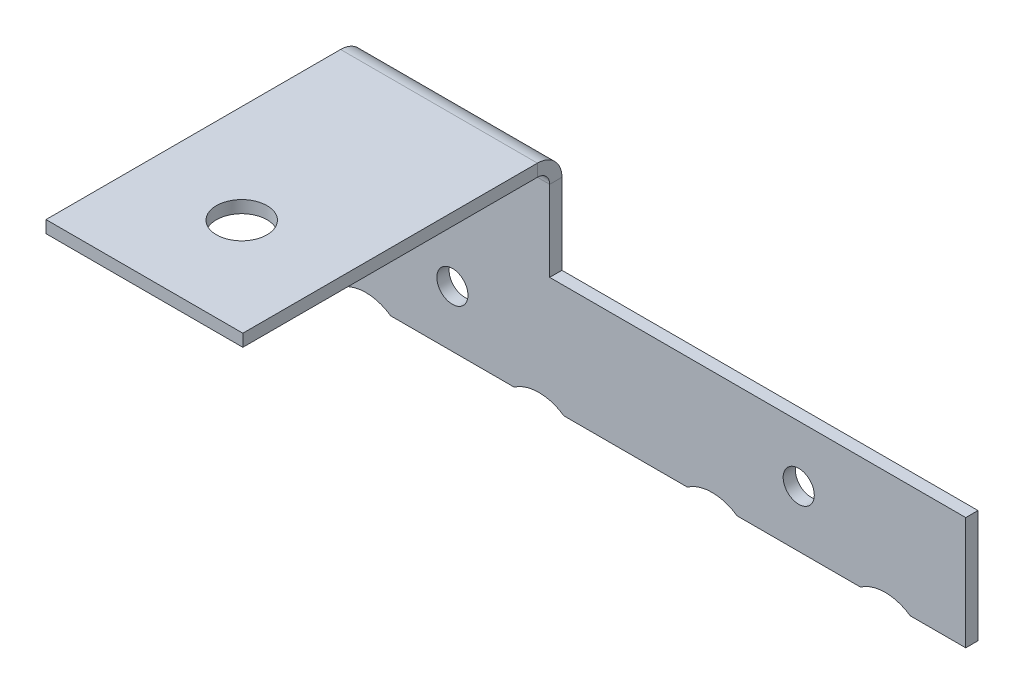
ISO-10303-21;
HEADER;
FILE_DESCRIPTION(('STEP AP214'),'2;1');
FILE_NAME('part.step','',(''),(''),'','','');
FILE_SCHEMA(('AUTOMOTIVE_DESIGN { 1 0 10303 214 1 1 1 1 }'));
ENDSEC;
DATA;
#1=APPLICATION_CONTEXT('core data for automotive mechanical design processes');
#2=APPLICATION_PROTOCOL_DEFINITION('international standard','automotive_design',2000,#1);
#3=PRODUCT_CONTEXT('',#1,'mechanical');
#4=PRODUCT('Part','Part','',(#3));
#5=PRODUCT_RELATED_PRODUCT_CATEGORY('part','',(#4));
#6=PRODUCT_DEFINITION_FORMATION('','',#4);
#7=PRODUCT_DEFINITION_CONTEXT('part definition',#1,'design');
#8=PRODUCT_DEFINITION('design','',#6,#7);
#9=PRODUCT_DEFINITION_SHAPE('','',#8);
#10=(LENGTH_UNIT() NAMED_UNIT(*) SI_UNIT(.MILLI.,.METRE.));
#11=(NAMED_UNIT(*) PLANE_ANGLE_UNIT() SI_UNIT($,.RADIAN.));
#12=(NAMED_UNIT(*) SI_UNIT($,.STERADIAN.) SOLID_ANGLE_UNIT());
#13=UNCERTAINTY_MEASURE_WITH_UNIT(LENGTH_MEASURE(1.E-05),#10,'distance_accuracy_value','');
#14=(GEOMETRIC_REPRESENTATION_CONTEXT(3) GLOBAL_UNCERTAINTY_ASSIGNED_CONTEXT((#13)) GLOBAL_UNIT_ASSIGNED_CONTEXT((#10,
#11,#12)) REPRESENTATION_CONTEXT('',''));
#15=CARTESIAN_POINT('',(0.,0.,0.));
#16=DIRECTION('',(0.,0.,1.));
#17=DIRECTION('',(1.,0.,0.));
#18=AXIS2_PLACEMENT_3D('',#15,#16,#17);
#19=CARTESIAN_POINT('',(-1.69445308686878,31.545800002,1.6));
#20=DIRECTION('',(-1.,0.,0.));
#21=DIRECTION('',(0.,-1.,0.));
#22=AXIS2_PLACEMENT_3D('',#19,#20,#21);
#23=PLANE('',#22);
#24=DIRECTION('',(0.,-1.,0.));
#25=VECTOR('',#24,1.);
#26=CARTESIAN_POINT('',(-1.69445308686878,31.545800002,1.6));
#27=LINE('',#26,#25);
#28=CARTESIAN_POINT('',(-1.69445308686878,29.9457999,1.6));
#29=VERTEX_POINT('',#28);
#30=CARTESIAN_POINT('',(-1.69445308686877,19.430000002,1.6));
#31=VERTEX_POINT('',#30);
#32=EDGE_CURVE('E243',#29,#31,#27,.T.);
#33=ORIENTED_EDGE('',*,*,#32,.F.);
#34=DIRECTION('',(0.,0.,-1.));
#35=VECTOR('',#34,1.);
#36=CARTESIAN_POINT('',(-1.69445308686877,29.9457999,1.6));
#37=LINE('',#36,#35);
#38=CARTESIAN_POINT('',(-1.69445308686877,29.9457999,-1.0200000045979E-07));
#39=VERTEX_POINT('',#38);
#40=EDGE_CURVE('E231',#29,#39,#37,.T.);
#41=ORIENTED_EDGE('',*,*,#40,.T.);
#42=DIRECTION('',(0.,1.,0.));
#43=VECTOR('',#42,1.);
#44=CARTESIAN_POINT('',(-1.69445308686877,0.,-1.01999999809269E-07));
#45=LINE('',#44,#43);
#46=CARTESIAN_POINT('',(-1.69445308686877,19.430000002,-1.01999999809269E-07));
#47=VERTEX_POINT('',#46);
#48=EDGE_CURVE('E293',#39,#47,#45,.F.);
#49=ORIENTED_EDGE('',*,*,#48,.T.);
#50=DIRECTION('',(0.,0.,1.));
#51=VECTOR('',#50,1.);
#52=CARTESIAN_POINT('',(-1.69445308686877,19.430000002,1.6));
#53=LINE('',#52,#51);
#54=EDGE_CURVE('E11',#47,#31,#53,.T.);
#55=ORIENTED_EDGE('',*,*,#54,.T.);
#56=EDGE_LOOP('',(#33,#41,#49,#55));
#57=FACE_BOUND('',#56,.T.);
#58=ADVANCED_FACE('F38',(#57),#23,.T.);
#59=CARTESIAN_POINT('',(67.818,0.,1.6));
#60=DIRECTION('',(0.,0.,1.));
#61=DIRECTION('',(1.,0.,0.));
#62=AXIS2_PLACEMENT_3D('',#59,#60,#61);
#63=PLANE('',#62);
#64=CARTESIAN_POINT('',(11.3029999999999,12.065,1.6));
#65=DIRECTION('',(0.,0.,1.));
#66=DIRECTION('',(1.,0.,0.));
#67=AXIS2_PLACEMENT_3D('',#64,#65,#66);
#68=CIRCLE('',#67,2.032);
#69=CARTESIAN_POINT('',(13.3349999999999,12.065,1.6));
#70=VERTEX_POINT('',#69);
#71=EDGE_CURVE('E240',#70,#70,#68,.T.);
#72=ORIENTED_EDGE('',*,*,#71,.F.);
#73=EDGE_LOOP('',(#72));
#74=FACE_BOUND('',#73,.T.);
#75=CARTESIAN_POINT('',(56.5149999999999,12.065,1.6));
#76=DIRECTION('',(0.,0.,1.));
#77=DIRECTION('',(1.,0.,0.));
#78=AXIS2_PLACEMENT_3D('',#75,#76,#77);
#79=CIRCLE('',#78,2.032);
#80=CARTESIAN_POINT('',(58.5469999999999,12.065,1.6));
#81=VERTEX_POINT('',#80);
#82=EDGE_CURVE('E287',#81,#81,#79,.T.);
#83=ORIENTED_EDGE('',*,*,#82,.F.);
#84=EDGE_LOOP('',(#83));
#85=FACE_BOUND('',#84,.T.);
#86=DIRECTION('',(0.,1.,0.));
#87=VECTOR('',#86,1.);
#88=CARTESIAN_POINT('',(24.0029999999999,31.545800002,1.6));
#89=LINE('',#88,#87);
#90=CARTESIAN_POINT('',(24.0029999999999,19.430000002,1.6));
#91=VERTEX_POINT('',#90);
#92=CARTESIAN_POINT('',(24.0029999999999,29.9457999,1.6));
#93=VERTEX_POINT('',#92);
#94=EDGE_CURVE('E285',#91,#93,#89,.T.);
#95=ORIENTED_EDGE('',*,*,#94,.T.);
#96=DIRECTION('',(-1.,0.,0.));
#97=VECTOR('',#96,1.);
#98=CARTESIAN_POINT('',(-1.69445308686877,29.9457999,1.6));
#99=LINE('',#98,#97);
#100=EDGE_CURVE('E61',#29,#93,#99,.F.);
#101=ORIENTED_EDGE('',*,*,#100,.F.);
#102=ORIENTED_EDGE('',*,*,#32,.T.);
#103=DIRECTION('',(-1.,0.,0.));
#104=VECTOR('',#103,1.);
#105=CARTESIAN_POINT('',(-1.69445308686877,19.430000002,1.6));
#106=LINE('',#105,#104);
#107=CARTESIAN_POINT('',(-10.5,19.430000002,1.6));
#108=VERTEX_POINT('',#107);
#109=EDGE_CURVE('E246',#31,#108,#106,.T.);
#110=ORIENTED_EDGE('',*,*,#109,.T.);
#111=DIRECTION('',(0.,-1.,0.));
#112=VECTOR('',#111,1.);
#113=CARTESIAN_POINT('',(-10.5,4.699999998,1.6));
#114=LINE('',#113,#112);
#115=CARTESIAN_POINT('',(-10.5,4.699999998,1.6));
#116=VERTEX_POINT('',#115);
#117=EDGE_CURVE('E249',#108,#116,#114,.T.);
#118=ORIENTED_EDGE('',*,*,#117,.T.);
#119=DIRECTION('',(1.,0.,0.));
#120=VECTOR('',#119,1.);
#121=CARTESIAN_POINT('',(-10.5,4.699999998,1.6));
#122=LINE('',#121,#120);
#123=CARTESIAN_POINT('',(-3.25309944451995,4.699999998,1.6));
#124=VERTEX_POINT('',#123);
#125=EDGE_CURVE('E252',#116,#124,#122,.T.);
#126=ORIENTED_EDGE('',*,*,#125,.T.);
#127=CARTESIAN_POINT('',(0.,0.,1.6));
#128=DIRECTION('',(0.,0.,-1.));
#129=DIRECTION('',(1.,0.,0.));
#130=AXIS2_PLACEMENT_3D('',#127,#128,#129);
#131=CIRCLE('',#130,5.715999998);
#132=CARTESIAN_POINT('',(3.25309944451995,4.699999998,1.6));
#133=VERTEX_POINT('',#132);
#134=EDGE_CURVE('E255',#124,#133,#131,.T.);
#135=ORIENTED_EDGE('',*,*,#134,.T.);
#136=DIRECTION('',(1.,0.,0.));
#137=VECTOR('',#136,1.);
#138=CARTESIAN_POINT('',(3.25309944451995,4.699999998,1.6));
#139=LINE('',#138,#137);
#140=CARTESIAN_POINT('',(19.3529005554801,4.699999998,1.6));
#141=VERTEX_POINT('',#140);
#142=EDGE_CURVE('E258',#133,#141,#139,.T.);
#143=ORIENTED_EDGE('',*,*,#142,.T.);
#144=CARTESIAN_POINT('',(22.606,0.,1.6));
#145=DIRECTION('',(0.,0.,-1.));
#146=DIRECTION('',(1.,0.,0.));
#147=AXIS2_PLACEMENT_3D('',#144,#145,#146);
#148=CIRCLE('',#147,5.715999998);
#149=CARTESIAN_POINT('',(25.85909944452,4.699999998,1.6));
#150=VERTEX_POINT('',#149);
#151=EDGE_CURVE('E261',#141,#150,#148,.T.);
#152=ORIENTED_EDGE('',*,*,#151,.T.);
#153=DIRECTION('',(1.,0.,0.));
#154=VECTOR('',#153,1.);
#155=CARTESIAN_POINT('',(25.85909944452,4.699999998,1.6));
#156=LINE('',#155,#154);
#157=CARTESIAN_POINT('',(41.95890055548,4.699999998,1.6));
#158=VERTEX_POINT('',#157);
#159=EDGE_CURVE('E264',#150,#158,#156,.T.);
#160=ORIENTED_EDGE('',*,*,#159,.T.);
#161=CARTESIAN_POINT('',(45.212,0.,1.6));
#162=DIRECTION('',(0.,0.,-1.));
#163=DIRECTION('',(1.,0.,0.));
#164=AXIS2_PLACEMENT_3D('',#161,#162,#163);
#165=CIRCLE('',#164,5.715999998);
#166=CARTESIAN_POINT('',(48.46509944452,4.699999998,1.6));
#167=VERTEX_POINT('',#166);
#168=EDGE_CURVE('E267',#158,#167,#165,.T.);
#169=ORIENTED_EDGE('',*,*,#168,.T.);
#170=DIRECTION('',(1.,0.,0.));
#171=VECTOR('',#170,1.);
#172=CARTESIAN_POINT('',(48.46509944452,4.699999998,1.6));
#173=LINE('',#172,#171);
#174=CARTESIAN_POINT('',(64.5649005554801,4.699999998,1.6));
#175=VERTEX_POINT('',#174);
#176=EDGE_CURVE('E270',#167,#175,#173,.T.);
#177=ORIENTED_EDGE('',*,*,#176,.T.);
#178=CARTESIAN_POINT('',(67.818,0.,1.6));
#179=DIRECTION('',(0.,0.,-1.));
#180=DIRECTION('',(1.,0.,0.));
#181=AXIS2_PLACEMENT_3D('',#178,#179,#180);
#182=CIRCLE('',#181,5.715999998);
#183=CARTESIAN_POINT('',(71.07109944452,4.699999998,1.6));
#184=VERTEX_POINT('',#183);
#185=EDGE_CURVE('E273',#175,#184,#182,.T.);
#186=ORIENTED_EDGE('',*,*,#185,.T.);
#187=DIRECTION('',(1.,0.,0.));
#188=VECTOR('',#187,1.);
#189=CARTESIAN_POINT('',(71.07109944452,4.699999998,1.6));
#190=LINE('',#189,#188);
#191=CARTESIAN_POINT('',(78.3179999999999,4.699999998,1.6));
#192=VERTEX_POINT('',#191);
#193=EDGE_CURVE('E276',#184,#192,#190,.T.);
#194=ORIENTED_EDGE('',*,*,#193,.T.);
#195=DIRECTION('',(0.,1.,0.));
#196=VECTOR('',#195,1.);
#197=CARTESIAN_POINT('',(78.3179999999999,4.699999998,1.6));
#198=LINE('',#197,#196);
#199=CARTESIAN_POINT('',(78.3179999999999,19.430000002,1.6));
#200=VERTEX_POINT('',#199);
#201=EDGE_CURVE('E279',#192,#200,#198,.T.);
#202=ORIENTED_EDGE('',*,*,#201,.T.);
#203=DIRECTION('',(-1.,0.,0.));
#204=VECTOR('',#203,1.);
#205=CARTESIAN_POINT('',(71.0710994445199,19.430000002,1.6));
#206=LINE('',#205,#204);
#207=EDGE_CURVE('E282',#200,#91,#206,.T.);
#208=ORIENTED_EDGE('',*,*,#207,.T.);
#209=EDGE_LOOP('',(#95,#101,#102,#110,#118,#126,#135,#143,#152,#160,#169,#177,#186,#194,#202,#208));
#210=FACE_BOUND('',#209,.T.);
#211=ADVANCED_FACE('F369',(#74,#85,#210),#63,.T.);
#212=CARTESIAN_POINT('',(67.818,0.,-1.01999999809269E-07));
#213=DIRECTION('',(0.,0.,1.));
#214=DIRECTION('',(1.,0.,0.));
#215=AXIS2_PLACEMENT_3D('',#212,#213,#214);
#216=PLANE('',#215);
#217=CARTESIAN_POINT('',(56.5149999999999,12.065,-1.01999999809269E-07));
#218=DIRECTION('',(0.,0.,1.));
#219=DIRECTION('',(1.,0.,0.));
#220=AXIS2_PLACEMENT_3D('',#217,#218,#219);
#221=CIRCLE('',#220,2.032);
#222=CARTESIAN_POINT('',(58.5469999999999,12.065,-1.01999999809269E-07));
#223=VERTEX_POINT('',#222);
#224=EDGE_CURVE('E244',#223,#223,#221,.T.);
#225=ORIENTED_EDGE('',*,*,#224,.T.);
#226=EDGE_LOOP('',(#225));
#227=FACE_BOUND('',#226,.T.);
#228=CARTESIAN_POINT('',(11.3029999999999,12.065,-1.01999999809269E-07));
#229=DIRECTION('',(0.,0.,1.));
#230=DIRECTION('',(1.,0.,0.));
#231=AXIS2_PLACEMENT_3D('',#228,#229,#230);
#232=CIRCLE('',#231,2.032);
#233=CARTESIAN_POINT('',(13.3349999999999,12.065,-1.01999999809269E-07));
#234=VERTEX_POINT('',#233);
#235=EDGE_CURVE('E238',#234,#234,#232,.T.);
#236=ORIENTED_EDGE('',*,*,#235,.T.);
#237=EDGE_LOOP('',(#236));
#238=FACE_BOUND('',#237,.T.);
#239=DIRECTION('',(-1.,0.,0.));
#240=VECTOR('',#239,1.);
#241=CARTESIAN_POINT('',(-1.69445308686877,29.9457999,-1.0200000045979E-07));
#242=LINE('',#241,#240);
#243=CARTESIAN_POINT('',(24.0029999999999,29.9457999,-1.01999999809269E-07));
#244=VERTEX_POINT('',#243);
#245=EDGE_CURVE('E185',#39,#244,#242,.F.);
#246=ORIENTED_EDGE('',*,*,#245,.T.);
#247=DIRECTION('',(0.,1.,0.));
#248=VECTOR('',#247,1.);
#249=CARTESIAN_POINT('',(24.0029999999999,0.,-1.01999999809269E-07));
#250=LINE('',#249,#248);
#251=CARTESIAN_POINT('',(24.0029999999999,19.430000002,-1.01999999809269E-07));
#252=VERTEX_POINT('',#251);
#253=EDGE_CURVE('E294',#252,#244,#250,.T.);
#254=ORIENTED_EDGE('',*,*,#253,.F.);
#255=DIRECTION('',(1.,0.,0.));
#256=VECTOR('',#255,1.);
#257=CARTESIAN_POINT('',(67.818,19.430000002,-1.01999999809269E-07));
#258=LINE('',#257,#256);
#259=CARTESIAN_POINT('',(78.3179999999999,19.430000002,-1.01999999809269E-07));
#260=VERTEX_POINT('',#259);
#261=EDGE_CURVE('E296',#260,#252,#258,.F.);
#262=ORIENTED_EDGE('',*,*,#261,.F.);
#263=DIRECTION('',(0.,1.,0.));
#264=VECTOR('',#263,1.);
#265=CARTESIAN_POINT('',(78.3179999999999,0.,-1.01999999809269E-07));
#266=LINE('',#265,#264);
#267=CARTESIAN_POINT('',(78.3179999999999,4.699999998,-1.01999999809269E-07));
#268=VERTEX_POINT('',#267);
#269=EDGE_CURVE('E299',#268,#260,#266,.T.);
#270=ORIENTED_EDGE('',*,*,#269,.F.);
#271=DIRECTION('',(1.,0.,0.));
#272=VECTOR('',#271,1.);
#273=CARTESIAN_POINT('',(67.818,4.699999998,-1.01999999809269E-07));
#274=LINE('',#273,#272);
#275=CARTESIAN_POINT('',(71.07109944452,4.699999998,-1.01999999809269E-07));
#276=VERTEX_POINT('',#275);
#277=EDGE_CURVE('E302',#276,#268,#274,.T.);
#278=ORIENTED_EDGE('',*,*,#277,.F.);
#279=CARTESIAN_POINT('',(67.818,0.,-1.01999999809269E-07));
#280=DIRECTION('',(0.,0.,-1.));
#281=DIRECTION('',(-1.,0.,0.));
#282=AXIS2_PLACEMENT_3D('',#279,#280,#281);
#283=CIRCLE('',#282,5.715999998);
#284=CARTESIAN_POINT('',(64.5649005554801,4.699999998,-1.01999999809269E-07));
#285=VERTEX_POINT('',#284);
#286=EDGE_CURVE('E305',#285,#276,#283,.T.);
#287=ORIENTED_EDGE('',*,*,#286,.F.);
#288=DIRECTION('',(1.,0.,0.));
#289=VECTOR('',#288,1.);
#290=CARTESIAN_POINT('',(67.818,4.699999998,-1.01999999809269E-07));
#291=LINE('',#290,#289);
#292=CARTESIAN_POINT('',(48.46509944452,4.699999998,-1.01999999809269E-07));
#293=VERTEX_POINT('',#292);
#294=EDGE_CURVE('E308',#293,#285,#291,.T.);
#295=ORIENTED_EDGE('',*,*,#294,.F.);
#296=CARTESIAN_POINT('',(45.212,0.,-1.01999999809269E-07));
#297=DIRECTION('',(0.,0.,-1.));
#298=DIRECTION('',(-1.,0.,0.));
#299=AXIS2_PLACEMENT_3D('',#296,#297,#298);
#300=CIRCLE('',#299,5.715999998);
#301=CARTESIAN_POINT('',(41.95890055548,4.699999998,-1.01999999809269E-07));
#302=VERTEX_POINT('',#301);
#303=EDGE_CURVE('E311',#302,#293,#300,.T.);
#304=ORIENTED_EDGE('',*,*,#303,.F.);
#305=DIRECTION('',(1.,0.,0.));
#306=VECTOR('',#305,1.);
#307=CARTESIAN_POINT('',(67.818,4.699999998,-1.01999999809269E-07));
#308=LINE('',#307,#306);
#309=CARTESIAN_POINT('',(25.85909944452,4.699999998,-1.01999999809269E-07));
#310=VERTEX_POINT('',#309);
#311=EDGE_CURVE('E314',#310,#302,#308,.T.);
#312=ORIENTED_EDGE('',*,*,#311,.F.);
#313=CARTESIAN_POINT('',(22.606,0.,-1.01999999809269E-07));
#314=DIRECTION('',(0.,0.,-1.));
#315=DIRECTION('',(-1.,0.,0.));
#316=AXIS2_PLACEMENT_3D('',#313,#314,#315);
#317=CIRCLE('',#316,5.715999998);
#318=CARTESIAN_POINT('',(19.3529005554801,4.699999998,-1.01999999809269E-07));
#319=VERTEX_POINT('',#318);
#320=EDGE_CURVE('E317',#319,#310,#317,.T.);
#321=ORIENTED_EDGE('',*,*,#320,.F.);
#322=DIRECTION('',(1.,0.,0.));
#323=VECTOR('',#322,1.);
#324=CARTESIAN_POINT('',(67.818,4.699999998,-1.01999999809269E-07));
#325=LINE('',#324,#323);
#326=CARTESIAN_POINT('',(3.25309944451995,4.699999998,-1.01999999809269E-07));
#327=VERTEX_POINT('',#326);
#328=EDGE_CURVE('E320',#327,#319,#325,.T.);
#329=ORIENTED_EDGE('',*,*,#328,.F.);
#330=CARTESIAN_POINT('',(0.,0.,-1.01999999809269E-07));
#331=DIRECTION('',(0.,0.,-1.));
#332=DIRECTION('',(-1.,0.,0.));
#333=AXIS2_PLACEMENT_3D('',#330,#331,#332);
#334=CIRCLE('',#333,5.715999998);
#335=CARTESIAN_POINT('',(-3.25309944451995,4.699999998,-1.01999999809269E-07));
#336=VERTEX_POINT('',#335);
#337=EDGE_CURVE('E323',#336,#327,#334,.T.);
#338=ORIENTED_EDGE('',*,*,#337,.F.);
#339=DIRECTION('',(1.,0.,0.));
#340=VECTOR('',#339,1.);
#341=CARTESIAN_POINT('',(67.818,4.699999998,-1.01999999809269E-07));
#342=LINE('',#341,#340);
#343=CARTESIAN_POINT('',(-10.5,4.699999998,-1.01999999809269E-07));
#344=VERTEX_POINT('',#343);
#345=EDGE_CURVE('E326',#344,#336,#342,.T.);
#346=ORIENTED_EDGE('',*,*,#345,.F.);
#347=DIRECTION('',(0.,1.,0.));
#348=VECTOR('',#347,1.);
#349=CARTESIAN_POINT('',(-10.5,0.,-1.01999999809269E-07));
#350=LINE('',#349,#348);
#351=CARTESIAN_POINT('',(-10.5,19.430000002,-1.01999999809269E-07));
#352=VERTEX_POINT('',#351);
#353=EDGE_CURVE('E329',#352,#344,#350,.F.);
#354=ORIENTED_EDGE('',*,*,#353,.F.);
#355=DIRECTION('',(1.,0.,0.));
#356=VECTOR('',#355,1.);
#357=CARTESIAN_POINT('',(67.818,19.430000002,-1.01999999809269E-07));
#358=LINE('',#357,#356);
#359=EDGE_CURVE('E332',#47,#352,#358,.F.);
#360=ORIENTED_EDGE('',*,*,#359,.F.);
#361=ORIENTED_EDGE('',*,*,#48,.F.);
#362=EDGE_LOOP('',(#246,#254,#262,#270,#278,#287,#295,#304,#312,#321,#329,#338,#346,#354,#360,#361));
#363=FACE_BOUND('',#362,.T.);
#364=ADVANCED_FACE('F377',(#227,#238,#363),#216,.F.);
#365=CARTESIAN_POINT('',(-1.69445308686877,19.430000002,1.6));
#366=DIRECTION('',(0.,1.,0.));
#367=DIRECTION('',(-1.,0.,0.));
#368=AXIS2_PLACEMENT_3D('',#365,#366,#367);
#369=PLANE('',#368);
#370=ORIENTED_EDGE('',*,*,#54,.F.);
#371=ORIENTED_EDGE('',*,*,#359,.T.);
#372=DIRECTION('',(0.,0.,1.));
#373=VECTOR('',#372,1.);
#374=CARTESIAN_POINT('',(-10.5,19.430000002,1.6));
#375=LINE('',#374,#373);
#376=EDGE_CURVE('E47',#352,#108,#375,.T.);
#377=ORIENTED_EDGE('',*,*,#376,.T.);
#378=ORIENTED_EDGE('',*,*,#109,.F.);
#379=EDGE_LOOP('',(#370,#371,#377,#378));
#380=FACE_BOUND('',#379,.T.);
#381=ADVANCED_FACE('F364',(#380),#369,.T.);
#382=CARTESIAN_POINT('',(-10.5,4.699999998,1.6));
#383=DIRECTION('',(-1.,0.,0.));
#384=DIRECTION('',(0.,-1.,0.));
#385=AXIS2_PLACEMENT_3D('',#382,#383,#384);
#386=PLANE('',#385);
#387=ORIENTED_EDGE('',*,*,#376,.F.);
#388=ORIENTED_EDGE('',*,*,#353,.T.);
#389=DIRECTION('',(0.,0.,1.));
#390=VECTOR('',#389,1.);
#391=CARTESIAN_POINT('',(-10.5,4.699999998,1.6));
#392=LINE('',#391,#390);
#393=EDGE_CURVE('E359',#344,#116,#392,.T.);
#394=ORIENTED_EDGE('',*,*,#393,.T.);
#395=ORIENTED_EDGE('',*,*,#117,.F.);
#396=EDGE_LOOP('',(#387,#388,#394,#395));
#397=FACE_BOUND('',#396,.T.);
#398=ADVANCED_FACE('F371',(#397),#386,.T.);
#399=CARTESIAN_POINT('',(-10.5,4.699999998,1.6));
#400=DIRECTION('',(0.,-1.,0.));
#401=DIRECTION('',(1.,0.,0.));
#402=AXIS2_PLACEMENT_3D('',#399,#400,#401);
#403=PLANE('',#402);
#404=ORIENTED_EDGE('',*,*,#393,.F.);
#405=ORIENTED_EDGE('',*,*,#345,.T.);
#406=DIRECTION('',(0.,0.,1.));
#407=VECTOR('',#406,1.);
#408=CARTESIAN_POINT('',(-3.25309944451995,4.699999998,1.6));
#409=LINE('',#408,#407);
#410=EDGE_CURVE('E357',#336,#124,#409,.T.);
#411=ORIENTED_EDGE('',*,*,#410,.T.);
#412=ORIENTED_EDGE('',*,*,#125,.F.);
#413=EDGE_LOOP('',(#404,#405,#411,#412));
#414=FACE_BOUND('',#413,.T.);
#415=ADVANCED_FACE('F374',(#414),#403,.T.);
#416=CARTESIAN_POINT('',(0.,0.,1.6));
#417=DIRECTION('',(0.,0.,1.));
#418=DIRECTION('',(1.,0.,0.));
#419=AXIS2_PLACEMENT_3D('',#416,#417,#418);
#420=CYLINDRICAL_SURFACE('',#419,5.715999998);
#421=ORIENTED_EDGE('',*,*,#410,.F.);
#422=ORIENTED_EDGE('',*,*,#337,.T.);
#423=DIRECTION('',(0.,0.,1.));
#424=VECTOR('',#423,1.);
#425=CARTESIAN_POINT('',(3.25309944451995,4.699999998,1.6));
#426=LINE('',#425,#424);
#427=EDGE_CURVE('E355',#327,#133,#426,.T.);
#428=ORIENTED_EDGE('',*,*,#427,.T.);
#429=ORIENTED_EDGE('',*,*,#134,.F.);
#430=EDGE_LOOP('',(#421,#422,#428,#429));
#431=FACE_BOUND('',#430,.T.);
#432=ADVANCED_FACE('F381',(#431),#420,.F.);
#433=CARTESIAN_POINT('',(3.25309944451995,4.699999998,1.6));
#434=DIRECTION('',(0.,-1.,0.));
#435=DIRECTION('',(1.,0.,0.));
#436=AXIS2_PLACEMENT_3D('',#433,#434,#435);
#437=PLANE('',#436);
#438=ORIENTED_EDGE('',*,*,#427,.F.);
#439=ORIENTED_EDGE('',*,*,#328,.T.);
#440=DIRECTION('',(0.,0.,1.));
#441=VECTOR('',#440,1.);
#442=CARTESIAN_POINT('',(19.3529005554801,4.699999998,1.6));
#443=LINE('',#442,#441);
#444=EDGE_CURVE('E353',#319,#141,#443,.T.);
#445=ORIENTED_EDGE('',*,*,#444,.T.);
#446=ORIENTED_EDGE('',*,*,#142,.F.);
#447=EDGE_LOOP('',(#438,#439,#445,#446));
#448=FACE_BOUND('',#447,.T.);
#449=ADVANCED_FACE('F386',(#448),#437,.T.);
#450=CARTESIAN_POINT('',(22.606,0.,1.6));
#451=DIRECTION('',(0.,0.,1.));
#452=DIRECTION('',(1.,0.,0.));
#453=AXIS2_PLACEMENT_3D('',#450,#451,#452);
#454=CYLINDRICAL_SURFACE('',#453,5.715999998);
#455=ORIENTED_EDGE('',*,*,#444,.F.);
#456=ORIENTED_EDGE('',*,*,#320,.T.);
#457=DIRECTION('',(0.,0.,1.));
#458=VECTOR('',#457,1.);
#459=CARTESIAN_POINT('',(25.85909944452,4.699999998,1.6));
#460=LINE('',#459,#458);
#461=EDGE_CURVE('E351',#310,#150,#460,.T.);
#462=ORIENTED_EDGE('',*,*,#461,.T.);
#463=ORIENTED_EDGE('',*,*,#151,.F.);
#464=EDGE_LOOP('',(#455,#456,#462,#463));
#465=FACE_BOUND('',#464,.T.);
#466=ADVANCED_FACE('F388',(#465),#454,.F.);
#467=CARTESIAN_POINT('',(25.85909944452,4.699999998,1.6));
#468=DIRECTION('',(0.,-1.,0.));
#469=DIRECTION('',(1.,0.,0.));
#470=AXIS2_PLACEMENT_3D('',#467,#468,#469);
#471=PLANE('',#470);
#472=ORIENTED_EDGE('',*,*,#461,.F.);
#473=ORIENTED_EDGE('',*,*,#311,.T.);
#474=DIRECTION('',(0.,0.,1.));
#475=VECTOR('',#474,1.);
#476=CARTESIAN_POINT('',(41.95890055548,4.699999998,1.6));
#477=LINE('',#476,#475);
#478=EDGE_CURVE('E349',#302,#158,#477,.T.);
#479=ORIENTED_EDGE('',*,*,#478,.T.);
#480=ORIENTED_EDGE('',*,*,#159,.F.);
#481=EDGE_LOOP('',(#472,#473,#479,#480));
#482=FACE_BOUND('',#481,.T.);
#483=ADVANCED_FACE('F393',(#482),#471,.T.);
#484=CARTESIAN_POINT('',(45.212,0.,1.6));
#485=DIRECTION('',(0.,0.,1.));
#486=DIRECTION('',(1.,0.,0.));
#487=AXIS2_PLACEMENT_3D('',#484,#485,#486);
#488=CYLINDRICAL_SURFACE('',#487,5.715999998);
#489=ORIENTED_EDGE('',*,*,#478,.F.);
#490=ORIENTED_EDGE('',*,*,#303,.T.);
#491=DIRECTION('',(0.,0.,1.));
#492=VECTOR('',#491,1.);
#493=CARTESIAN_POINT('',(48.46509944452,4.699999998,1.6));
#494=LINE('',#493,#492);
#495=EDGE_CURVE('E347',#293,#167,#494,.T.);
#496=ORIENTED_EDGE('',*,*,#495,.T.);
#497=ORIENTED_EDGE('',*,*,#168,.F.);
#498=EDGE_LOOP('',(#489,#490,#496,#497));
#499=FACE_BOUND('',#498,.T.);
#500=ADVANCED_FACE('F398',(#499),#488,.F.);
#501=CARTESIAN_POINT('',(48.46509944452,4.699999998,1.6));
#502=DIRECTION('',(0.,-1.,0.));
#503=DIRECTION('',(1.,0.,0.));
#504=AXIS2_PLACEMENT_3D('',#501,#502,#503);
#505=PLANE('',#504);
#506=ORIENTED_EDGE('',*,*,#495,.F.);
#507=ORIENTED_EDGE('',*,*,#294,.T.);
#508=DIRECTION('',(0.,0.,1.));
#509=VECTOR('',#508,1.);
#510=CARTESIAN_POINT('',(64.5649005554801,4.699999998,1.6));
#511=LINE('',#510,#509);
#512=EDGE_CURVE('E345',#285,#175,#511,.T.);
#513=ORIENTED_EDGE('',*,*,#512,.T.);
#514=ORIENTED_EDGE('',*,*,#176,.F.);
#515=EDGE_LOOP('',(#506,#507,#513,#514));
#516=FACE_BOUND('',#515,.T.);
#517=ADVANCED_FACE('F400',(#516),#505,.T.);
#518=CARTESIAN_POINT('',(67.818,0.,1.6));
#519=DIRECTION('',(0.,0.,1.));
#520=DIRECTION('',(1.,0.,0.));
#521=AXIS2_PLACEMENT_3D('',#518,#519,#520);
#522=CYLINDRICAL_SURFACE('',#521,5.715999998);
#523=ORIENTED_EDGE('',*,*,#512,.F.);
#524=ORIENTED_EDGE('',*,*,#286,.T.);
#525=DIRECTION('',(0.,0.,1.));
#526=VECTOR('',#525,1.);
#527=CARTESIAN_POINT('',(71.07109944452,4.699999998,1.6));
#528=LINE('',#527,#526);
#529=EDGE_CURVE('E343',#276,#184,#528,.T.);
#530=ORIENTED_EDGE('',*,*,#529,.T.);
#531=ORIENTED_EDGE('',*,*,#185,.F.);
#532=EDGE_LOOP('',(#523,#524,#530,#531));
#533=FACE_BOUND('',#532,.T.);
#534=ADVANCED_FACE('F405',(#533),#522,.F.);
#535=CARTESIAN_POINT('',(71.07109944452,4.699999998,1.6));
#536=DIRECTION('',(0.,-1.,0.));
#537=DIRECTION('',(1.,0.,0.));
#538=AXIS2_PLACEMENT_3D('',#535,#536,#537);
#539=PLANE('',#538);
#540=ORIENTED_EDGE('',*,*,#529,.F.);
#541=ORIENTED_EDGE('',*,*,#277,.T.);
#542=DIRECTION('',(0.,0.,1.));
#543=VECTOR('',#542,1.);
#544=CARTESIAN_POINT('',(78.3179999999999,4.699999998,1.6));
#545=LINE('',#544,#543);
#546=EDGE_CURVE('E341',#268,#192,#545,.T.);
#547=ORIENTED_EDGE('',*,*,#546,.T.);
#548=ORIENTED_EDGE('',*,*,#193,.F.);
#549=EDGE_LOOP('',(#540,#541,#547,#548));
#550=FACE_BOUND('',#549,.T.);
#551=ADVANCED_FACE('F410',(#550),#539,.T.);
#552=CARTESIAN_POINT('',(78.3179999999999,4.699999998,1.6));
#553=DIRECTION('',(1.,0.,0.));
#554=DIRECTION('',(0.,1.,0.));
#555=AXIS2_PLACEMENT_3D('',#552,#553,#554);
#556=PLANE('',#555);
#557=ORIENTED_EDGE('',*,*,#546,.F.);
#558=ORIENTED_EDGE('',*,*,#269,.T.);
#559=DIRECTION('',(0.,0.,1.));
#560=VECTOR('',#559,1.);
#561=CARTESIAN_POINT('',(78.3179999999999,19.430000002,1.6));
#562=LINE('',#561,#560);
#563=EDGE_CURVE('E339',#260,#200,#562,.T.);
#564=ORIENTED_EDGE('',*,*,#563,.T.);
#565=ORIENTED_EDGE('',*,*,#201,.F.);
#566=EDGE_LOOP('',(#557,#558,#564,#565));
#567=FACE_BOUND('',#566,.T.);
#568=ADVANCED_FACE('F412',(#567),#556,.T.);
#569=CARTESIAN_POINT('',(71.0710994445199,19.430000002,1.6));
#570=DIRECTION('',(0.,1.,0.));
#571=DIRECTION('',(-1.,0.,0.));
#572=AXIS2_PLACEMENT_3D('',#569,#570,#571);
#573=PLANE('',#572);
#574=ORIENTED_EDGE('',*,*,#563,.F.);
#575=ORIENTED_EDGE('',*,*,#261,.T.);
#576=DIRECTION('',(0.,0.,1.));
#577=VECTOR('',#576,1.);
#578=CARTESIAN_POINT('',(24.0029999999999,19.430000002,1.6));
#579=LINE('',#578,#577);
#580=EDGE_CURVE('E290',#252,#91,#579,.T.);
#581=ORIENTED_EDGE('',*,*,#580,.T.);
#582=ORIENTED_EDGE('',*,*,#207,.F.);
#583=EDGE_LOOP('',(#574,#575,#581,#582));
#584=FACE_BOUND('',#583,.T.);
#585=ADVANCED_FACE('F416',(#584),#573,.T.);
#586=CARTESIAN_POINT('',(24.0029999999999,31.545800002,1.6));
#587=DIRECTION('',(1.,0.,0.));
#588=DIRECTION('',(0.,1.,0.));
#589=AXIS2_PLACEMENT_3D('',#586,#587,#588);
#590=PLANE('',#589);
#591=DIRECTION('',(0.,0.,-1.));
#592=VECTOR('',#591,1.);
#593=CARTESIAN_POINT('',(24.0029999999999,29.9457999,1.6));
#594=LINE('',#593,#592);
#595=EDGE_CURVE('E54',#93,#244,#594,.T.);
#596=ORIENTED_EDGE('',*,*,#595,.F.);
#597=ORIENTED_EDGE('',*,*,#94,.F.);
#598=ORIENTED_EDGE('',*,*,#580,.F.);
#599=ORIENTED_EDGE('',*,*,#253,.T.);
#600=EDGE_LOOP('',(#596,#597,#598,#599));
#601=FACE_BOUND('',#600,.T.);
#602=ADVANCED_FACE('F418',(#601),#590,.T.);
#603=CARTESIAN_POINT('',(11.3029999999999,12.065,1.6));
#604=DIRECTION('',(0.,0.,1.));
#605=DIRECTION('',(1.,0.,0.));
#606=AXIS2_PLACEMENT_3D('',#603,#604,#605);
#607=CYLINDRICAL_SURFACE('',#606,2.032);
#608=ORIENTED_EDGE('',*,*,#71,.T.);
#609=EDGE_LOOP('',(#608));
#610=FACE_BOUND('',#609,.T.);
#611=ORIENTED_EDGE('',*,*,#235,.F.);
#612=EDGE_LOOP('',(#611));
#613=FACE_BOUND('',#612,.T.);
#614=ADVANCED_FACE('F485',(#610,#613),#607,.F.);
#615=CARTESIAN_POINT('',(56.5149999999999,12.065,1.6));
#616=DIRECTION('',(0.,0.,1.));
#617=DIRECTION('',(1.,0.,0.));
#618=AXIS2_PLACEMENT_3D('',#615,#616,#617);
#619=CYLINDRICAL_SURFACE('',#618,2.032);
#620=ORIENTED_EDGE('',*,*,#82,.T.);
#621=EDGE_LOOP('',(#620));
#622=FACE_BOUND('',#621,.T.);
#623=ORIENTED_EDGE('',*,*,#224,.F.);
#624=EDGE_LOOP('',(#623));
#625=FACE_BOUND('',#624,.T.);
#626=ADVANCED_FACE('F40',(#622,#625),#619,.F.);
#627=CARTESIAN_POINT('',(24.0029999999999,29.9457999,3.200000102));
#628=DIRECTION('',(1.,0.,0.));
#629=DIRECTION('',(0.,0.,-1.));
#630=AXIS2_PLACEMENT_3D('',#627,#628,#629);
#631=PLANE('',#630);
#632=DIRECTION('',(0.,1.,0.));
#633=VECTOR('',#632,1.);
#634=CARTESIAN_POINT('',(24.0029999999999,31.545800002,3.20000010199999));
#635=LINE('',#634,#633);
#636=CARTESIAN_POINT('',(24.0029999999999,31.545800002,3.20000010199999));
#637=VERTEX_POINT('',#636);
#638=CARTESIAN_POINT('',(24.0029999999999,33.145800104,3.20000010199999));
#639=VERTEX_POINT('',#638);
#640=EDGE_CURVE('E423',#637,#639,#635,.T.);
#641=ORIENTED_EDGE('',*,*,#640,.F.);
#642=CARTESIAN_POINT('',(24.0029999999999,29.9457999,3.200000102));
#643=DIRECTION('',(-1.,0.,0.));
#644=DIRECTION('',(0.,0.,1.));
#645=AXIS2_PLACEMENT_3D('',#642,#643,#644);
#646=CIRCLE('',#645,1.600000102);
#647=EDGE_CURVE('E188',#93,#637,#646,.F.);
#648=ORIENTED_EDGE('',*,*,#647,.F.);
#649=ORIENTED_EDGE('',*,*,#595,.T.);
#650=CARTESIAN_POINT('',(24.0029999999999,29.9457999,3.200000102));
#651=DIRECTION('',(-1.,0.,0.));
#652=DIRECTION('',(0.,0.,1.));
#653=AXIS2_PLACEMENT_3D('',#650,#651,#652);
#654=CIRCLE('',#653,3.200000204);
#655=EDGE_CURVE('E230',#244,#639,#654,.F.);
#656=ORIENTED_EDGE('',*,*,#655,.T.);
#657=EDGE_LOOP('',(#641,#648,#649,#656));
#658=FACE_BOUND('',#657,.T.);
#659=ADVANCED_FACE('F421',(#658),#631,.T.);
#660=CARTESIAN_POINT('',(-1.69445308686877,29.9457999,3.200000102));
#661=DIRECTION('',(1.,0.,0.));
#662=DIRECTION('',(0.,0.,-1.));
#663=AXIS2_PLACEMENT_3D('',#660,#661,#662);
#664=PLANE('',#663);
#665=CARTESIAN_POINT('',(-1.69445308686877,29.9457999,3.200000102));
#666=DIRECTION('',(-1.,0.,0.));
#667=DIRECTION('',(0.,0.,1.));
#668=AXIS2_PLACEMENT_3D('',#665,#666,#667);
#669=CIRCLE('',#668,1.600000102);
#670=CARTESIAN_POINT('',(-1.69445308686877,31.545800002,3.20000010199999));
#671=VERTEX_POINT('',#670);
#672=EDGE_CURVE('E195',#671,#29,#669,.T.);
#673=ORIENTED_EDGE('',*,*,#672,.F.);
#674=DIRECTION('',(0.,1.,0.));
#675=VECTOR('',#674,1.);
#676=CARTESIAN_POINT('',(-1.69445308686877,31.545800002,3.20000010199999));
#677=LINE('',#676,#675);
#678=CARTESIAN_POINT('',(-1.69445308686877,33.145800104,3.20000010199999));
#679=VERTEX_POINT('',#678);
#680=EDGE_CURVE('E192',#671,#679,#677,.T.);
#681=ORIENTED_EDGE('',*,*,#680,.T.);
#682=CARTESIAN_POINT('',(-1.69445308686877,29.9457999,3.200000102));
#683=DIRECTION('',(-1.,0.,0.));
#684=DIRECTION('',(0.,0.,1.));
#685=AXIS2_PLACEMENT_3D('',#682,#683,#684);
#686=CIRCLE('',#685,3.200000204);
#687=EDGE_CURVE('E178',#679,#39,#686,.T.);
#688=ORIENTED_EDGE('',*,*,#687,.T.);
#689=ORIENTED_EDGE('',*,*,#40,.F.);
#690=EDGE_LOOP('',(#673,#681,#688,#689));
#691=FACE_BOUND('',#690,.T.);
#692=ADVANCED_FACE('F193',(#691),#664,.F.);
#693=CARTESIAN_POINT('',(-1.69445308686877,29.9457999,3.200000102));
#694=DIRECTION('',(-1.,0.,0.));
#695=DIRECTION('',(0.,1.,0.));
#696=AXIS2_PLACEMENT_3D('',#693,#694,#695);
#697=CYLINDRICAL_SURFACE('',#696,3.200000204);
#698=ORIENTED_EDGE('',*,*,#245,.F.);
#699=ORIENTED_EDGE('',*,*,#687,.F.);
#700=DIRECTION('',(1.,0.,0.));
#701=VECTOR('',#700,1.);
#702=CARTESIAN_POINT('',(0.,33.145800104,3.20000010199999));
#703=LINE('',#702,#701);
#704=EDGE_CURVE('E183',#679,#639,#703,.T.);
#705=ORIENTED_EDGE('',*,*,#704,.T.);
#706=ORIENTED_EDGE('',*,*,#655,.F.);
#707=EDGE_LOOP('',(#698,#699,#705,#706));
#708=FACE_BOUND('',#707,.T.);
#709=ADVANCED_FACE('F180',(#708),#697,.T.);
#710=CARTESIAN_POINT('',(-1.69445308686877,29.9457999,3.200000102));
#711=DIRECTION('',(-1.,0.,0.));
#712=DIRECTION('',(0.,1.,0.));
#713=AXIS2_PLACEMENT_3D('',#710,#711,#712);
#714=CYLINDRICAL_SURFACE('',#713,1.600000102);
#715=ORIENTED_EDGE('',*,*,#100,.T.);
#716=ORIENTED_EDGE('',*,*,#647,.T.);
#717=DIRECTION('',(-1.,0.,0.));
#718=VECTOR('',#717,1.);
#719=CARTESIAN_POINT('',(24.0029999999999,31.545800002,3.20000010199999));
#720=LINE('',#719,#718);
#721=EDGE_CURVE('E199',#637,#671,#720,.T.);
#722=ORIENTED_EDGE('',*,*,#721,.T.);
#723=ORIENTED_EDGE('',*,*,#672,.T.);
#724=EDGE_LOOP('',(#715,#716,#722,#723));
#725=FACE_BOUND('',#724,.T.);
#726=ADVANCED_FACE('F426',(#725),#714,.F.);
#727=CARTESIAN_POINT('',(24.0029999999999,33.145800104,1.59999999999999));
#728=DIRECTION('',(-1.,0.,0.));
#729=DIRECTION('',(0.,0.,1.));
#730=AXIS2_PLACEMENT_3D('',#727,#728,#729);
#731=PLANE('',#730);
#732=ORIENTED_EDGE('',*,*,#640,.T.);
#733=DIRECTION('',(0.,0.,-1.));
#734=VECTOR('',#733,1.);
#735=CARTESIAN_POINT('',(24.0029999999999,33.145800104,1.59999999999999));
#736=LINE('',#735,#734);
#737=CARTESIAN_POINT('',(24.0029999999999,33.1458001040001,41.655999898));
#738=VERTEX_POINT('',#737);
#739=EDGE_CURVE('E207',#738,#639,#736,.T.);
#740=ORIENTED_EDGE('',*,*,#739,.F.);
#741=DIRECTION('',(0.,-1.,0.));
#742=VECTOR('',#741,1.);
#743=CARTESIAN_POINT('',(24.0029999999999,33.1458001040001,41.655999898));
#744=LINE('',#743,#742);
#745=CARTESIAN_POINT('',(24.0029999999999,31.5458000020001,41.655999898));
#746=VERTEX_POINT('',#745);
#747=EDGE_CURVE('E216',#738,#746,#744,.T.);
#748=ORIENTED_EDGE('',*,*,#747,.T.);
#749=DIRECTION('',(0.,0.,-1.));
#750=VECTOR('',#749,1.);
#751=CARTESIAN_POINT('',(24.0029999999999,31.545800002,1.6));
#752=LINE('',#751,#750);
#753=EDGE_CURVE('E208',#746,#637,#752,.T.);
#754=ORIENTED_EDGE('',*,*,#753,.T.);
#755=EDGE_LOOP('',(#732,#740,#748,#754));
#756=FACE_BOUND('',#755,.T.);
#757=ADVANCED_FACE('F433',(#756),#731,.F.);
#758=CARTESIAN_POINT('',(-1.69445308686877,33.1458001040001,41.655999898));
#759=DIRECTION('',(1.,0.,0.));
#760=DIRECTION('',(0.,0.,-1.));
#761=AXIS2_PLACEMENT_3D('',#758,#759,#760);
#762=PLANE('',#761);
#763=ORIENTED_EDGE('',*,*,#680,.F.);
#764=DIRECTION('',(0.,0.,1.));
#765=VECTOR('',#764,1.);
#766=CARTESIAN_POINT('',(-1.69445308686877,31.5458000020001,41.655999898));
#767=LINE('',#766,#765);
#768=CARTESIAN_POINT('',(-1.69445308686877,31.5458000020001,41.655999898));
#769=VERTEX_POINT('',#768);
#770=EDGE_CURVE('E223',#671,#769,#767,.T.);
#771=ORIENTED_EDGE('',*,*,#770,.T.);
#772=DIRECTION('',(0.,-1.,0.));
#773=VECTOR('',#772,1.);
#774=CARTESIAN_POINT('',(-1.69445308686877,33.1458001040001,41.655999898));
#775=LINE('',#774,#773);
#776=CARTESIAN_POINT('',(-1.69445308686877,33.1458001040001,41.655999898));
#777=VERTEX_POINT('',#776);
#778=EDGE_CURVE('E212',#777,#769,#775,.T.);
#779=ORIENTED_EDGE('',*,*,#778,.F.);
#780=DIRECTION('',(0.,0.,1.));
#781=VECTOR('',#780,1.);
#782=CARTESIAN_POINT('',(-1.69445308686877,33.1458001040001,41.655999898));
#783=LINE('',#782,#781);
#784=EDGE_CURVE('E204',#679,#777,#783,.T.);
#785=ORIENTED_EDGE('',*,*,#784,.F.);
#786=EDGE_LOOP('',(#763,#771,#779,#785));
#787=FACE_BOUND('',#786,.T.);
#788=ADVANCED_FACE('F210',(#787),#762,.F.);
#789=CARTESIAN_POINT('',(0.,33.145800104,-1.14879839584135E-13));
#790=DIRECTION('',(0.,-1.,0.));
#791=DIRECTION('',(0.,0.,-1.));
#792=AXIS2_PLACEMENT_3D('',#789,#790,#791);
#793=PLANE('',#792);
#794=CARTESIAN_POINT('',(11.1542734565656,33.1458001040001,28.955999898));
#795=DIRECTION('',(0.,1.,0.));
#796=DIRECTION('',(0.,0.,1.));
#797=AXIS2_PLACEMENT_3D('',#794,#795,#796);
#798=CIRCLE('',#797,3.302);
#799=CARTESIAN_POINT('',(11.1542734565656,33.1458001040001,32.257999898));
#800=VERTEX_POINT('',#799);
#801=EDGE_CURVE('E511',#800,#800,#798,.T.);
#802=ORIENTED_EDGE('',*,*,#801,.F.);
#803=EDGE_LOOP('',(#802));
#804=FACE_BOUND('',#803,.T.);
#805=ORIENTED_EDGE('',*,*,#704,.F.);
#806=ORIENTED_EDGE('',*,*,#784,.T.);
#807=DIRECTION('',(1.,0.,0.));
#808=VECTOR('',#807,1.);
#809=CARTESIAN_POINT('',(24.0029999999999,33.1458001040001,41.655999898));
#810=LINE('',#809,#808);
#811=EDGE_CURVE('E214',#777,#738,#810,.T.);
#812=ORIENTED_EDGE('',*,*,#811,.T.);
#813=ORIENTED_EDGE('',*,*,#739,.T.);
#814=EDGE_LOOP('',(#805,#806,#812,#813));
#815=FACE_BOUND('',#814,.T.);
#816=ADVANCED_FACE('F203',(#804,#815),#793,.F.);
#817=CARTESIAN_POINT('',(0.,31.545800002,-1.09293469085855E-13));
#818=DIRECTION('',(0.,-1.,0.));
#819=DIRECTION('',(0.,0.,-1.));
#820=AXIS2_PLACEMENT_3D('',#817,#818,#819);
#821=PLANE('',#820);
#822=CARTESIAN_POINT('',(11.1542734565656,31.5458000020001,28.955999898));
#823=DIRECTION('',(0.,-1.,0.));
#824=DIRECTION('',(0.,0.,-1.));
#825=AXIS2_PLACEMENT_3D('',#822,#823,#824);
#826=CIRCLE('',#825,3.302);
#827=CARTESIAN_POINT('',(11.1542734565656,31.5458000020001,25.653999898));
#828=VERTEX_POINT('',#827);
#829=EDGE_CURVE('E42',#828,#828,#826,.T.);
#830=ORIENTED_EDGE('',*,*,#829,.F.);
#831=EDGE_LOOP('',(#830));
#832=FACE_BOUND('',#831,.T.);
#833=ORIENTED_EDGE('',*,*,#770,.F.);
#834=ORIENTED_EDGE('',*,*,#721,.F.);
#835=ORIENTED_EDGE('',*,*,#753,.F.);
#836=DIRECTION('',(1.,0.,0.));
#837=VECTOR('',#836,1.);
#838=CARTESIAN_POINT('',(24.0029999999999,31.5458000020001,41.655999898));
#839=LINE('',#838,#837);
#840=EDGE_CURVE('E218',#769,#746,#839,.T.);
#841=ORIENTED_EDGE('',*,*,#840,.F.);
#842=EDGE_LOOP('',(#833,#834,#835,#841));
#843=FACE_BOUND('',#842,.T.);
#844=ADVANCED_FACE('F429',(#832,#843),#821,.T.);
#845=CARTESIAN_POINT('',(24.0029999999999,33.1458001040001,41.655999898));
#846=DIRECTION('',(0.,0.,-1.));
#847=DIRECTION('',(0.,1.,0.));
#848=AXIS2_PLACEMENT_3D('',#845,#846,#847);
#849=PLANE('',#848);
#850=ORIENTED_EDGE('',*,*,#840,.T.);
#851=ORIENTED_EDGE('',*,*,#747,.F.);
#852=ORIENTED_EDGE('',*,*,#811,.F.);
#853=ORIENTED_EDGE('',*,*,#778,.T.);
#854=EDGE_LOOP('',(#850,#851,#852,#853));
#855=FACE_BOUND('',#854,.T.);
#856=ADVANCED_FACE('F436',(#855),#849,.F.);
#857=CARTESIAN_POINT('',(11.1542734565656,4.69999999799995,28.9559998980001));
#858=DIRECTION('',(0.,1.,0.));
#859=DIRECTION('',(0.,0.,1.));
#860=AXIS2_PLACEMENT_3D('',#857,#858,#859);
#861=CYLINDRICAL_SURFACE('',#860,3.302);
#862=ORIENTED_EDGE('',*,*,#829,.T.);
#863=EDGE_LOOP('',(#862));
#864=FACE_BOUND('',#863,.T.);
#865=ORIENTED_EDGE('',*,*,#801,.T.);
#866=EDGE_LOOP('',(#865));
#867=FACE_BOUND('',#866,.T.);
#868=ADVANCED_FACE('F438',(#864,#867),#861,.F.);
#869=CLOSED_SHELL('',(#58,#211,#364,#381,#398,#415,#432,#449,#466,#483,#500,#517,#534,#551,#568,
#585,#602,#614,#626,#659,#692,#709,#726,#757,#788,#816,#844,#856,#868));
#870=MANIFOLD_SOLID_BREP('B2',#869);
#871=ADVANCED_BREP_SHAPE_REPRESENTATION('',(#18,#870),#14);
#872=SHAPE_DEFINITION_REPRESENTATION(#9,#871);
ENDSEC;
END-ISO-10303-21;
